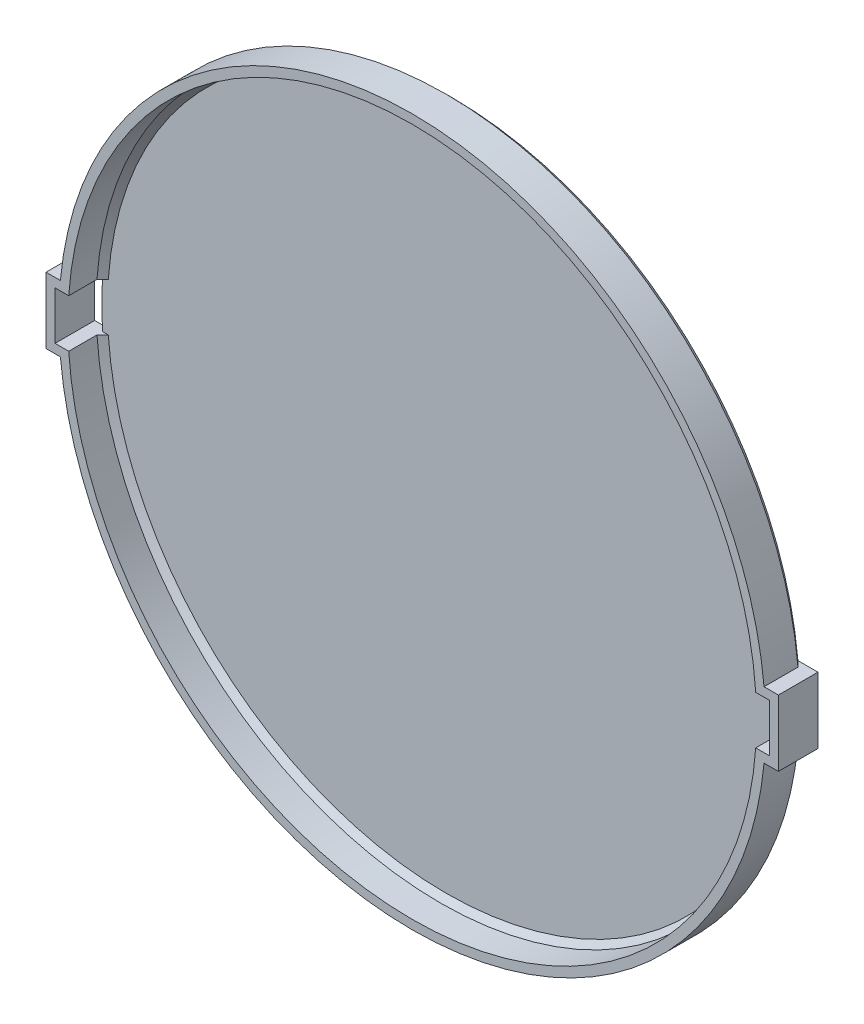
ISO-10303-21;
HEADER;
FILE_DESCRIPTION(('STEP AP214'),'2;1');
FILE_NAME('part.step','',(''),(''),'','','');
FILE_SCHEMA(('AUTOMOTIVE_DESIGN { 1 0 10303 214 1 1 1 1 }'));
ENDSEC;
DATA;
#1=APPLICATION_CONTEXT('core data for automotive mechanical design processes');
#2=APPLICATION_PROTOCOL_DEFINITION('international standard','automotive_design',2000,#1);
#3=PRODUCT_CONTEXT('',#1,'mechanical');
#4=PRODUCT('Part','Part','',(#3));
#5=PRODUCT_RELATED_PRODUCT_CATEGORY('part','',(#4));
#6=PRODUCT_DEFINITION_FORMATION('','',#4);
#7=PRODUCT_DEFINITION_CONTEXT('part definition',#1,'design');
#8=PRODUCT_DEFINITION('design','',#6,#7);
#9=PRODUCT_DEFINITION_SHAPE('','',#8);
#10=(LENGTH_UNIT() NAMED_UNIT(*) SI_UNIT(.MILLI.,.METRE.));
#11=(NAMED_UNIT(*) PLANE_ANGLE_UNIT() SI_UNIT($,.RADIAN.));
#12=(NAMED_UNIT(*) SI_UNIT($,.STERADIAN.) SOLID_ANGLE_UNIT());
#13=UNCERTAINTY_MEASURE_WITH_UNIT(LENGTH_MEASURE(1.E-05),#10,'distance_accuracy_value','');
#14=(GEOMETRIC_REPRESENTATION_CONTEXT(3) GLOBAL_UNCERTAINTY_ASSIGNED_CONTEXT((#13)) GLOBAL_UNIT_ASSIGNED_CONTEXT((#10,
#11,#12)) REPRESENTATION_CONTEXT('',''));
#15=CARTESIAN_POINT('',(0.,0.,0.));
#16=DIRECTION('',(0.,0.,1.));
#17=DIRECTION('',(1.,0.,0.));
#18=AXIS2_PLACEMENT_3D('',#15,#16,#17);
#19=CARTESIAN_POINT('',(0.,0.,6.));
#20=DIRECTION('',(0.,0.,-1.));
#21=DIRECTION('',(-1.,0.,0.));
#22=AXIS2_PLACEMENT_3D('',#19,#20,#21);
#23=CYLINDRICAL_SURFACE('',#22,62.5);
#24=DIRECTION('',(0.,0.,-1.));
#25=VECTOR('',#24,1.);
#26=CARTESIAN_POINT('',(-62.225617714893,-5.85,17.9719254138495));
#27=LINE('',#26,#25);
#28=CARTESIAN_POINT('',(-62.225617714893,-5.85,6.));
#29=VERTEX_POINT('',#28);
#30=CARTESIAN_POINT('',(-62.225617714893,-5.85,0.));
#31=VERTEX_POINT('',#30);
#32=EDGE_CURVE('E288',#29,#31,#27,.T.);
#33=ORIENTED_EDGE('',*,*,#32,.T.);
#34=CARTESIAN_POINT('',(0.,0.,0.));
#35=DIRECTION('',(0.,0.,1.));
#36=DIRECTION('',(1.,0.,0.));
#37=AXIS2_PLACEMENT_3D('',#34,#35,#36);
#38=CIRCLE('',#37,62.5);
#39=CARTESIAN_POINT('',(62.225617714893,-5.85,0.));
#40=VERTEX_POINT('',#39);
#41=EDGE_CURVE('E345',#31,#40,#38,.T.);
#42=ORIENTED_EDGE('',*,*,#41,.T.);
#43=DIRECTION('',(0.,0.,-1.));
#44=VECTOR('',#43,1.);
#45=CARTESIAN_POINT('',(62.225617714893,-5.85,17.9719254138495));
#46=LINE('',#45,#44);
#47=CARTESIAN_POINT('',(62.225617714893,-5.85,6.));
#48=VERTEX_POINT('',#47);
#49=EDGE_CURVE('E248',#48,#40,#46,.T.);
#50=ORIENTED_EDGE('',*,*,#49,.F.);
#51=CARTESIAN_POINT('',(0.,0.,6.));
#52=DIRECTION('',(0.,0.,1.));
#53=DIRECTION('',(1.,0.,0.));
#54=AXIS2_PLACEMENT_3D('',#51,#52,#53);
#55=CIRCLE('',#54,62.5);
#56=EDGE_CURVE('E331',#29,#48,#55,.T.);
#57=ORIENTED_EDGE('',*,*,#56,.F.);
#58=EDGE_LOOP('',(#33,#42,#50,#57));
#59=FACE_BOUND('',#58,.T.);
#60=ADVANCED_FACE('F35',(#59),#23,.T.);
#61=CARTESIAN_POINT('',(0.,0.,6.));
#62=DIRECTION('',(0.,0.,-1.));
#63=DIRECTION('',(-1.,0.,0.));
#64=AXIS2_PLACEMENT_3D('',#61,#62,#63);
#65=CYLINDRICAL_SURFACE('',#64,60.9);
#66=DIRECTION('',(0.,0.,-1.));
#67=VECTOR('',#66,1.);
#68=CARTESIAN_POINT('',(60.7515226146637,-4.25,6.));
#69=LINE('',#68,#67);
#70=CARTESIAN_POINT('',(60.7515226146637,-4.25,6.));
#71=VERTEX_POINT('',#70);
#72=CARTESIAN_POINT('',(60.7515226146637,-4.25,0.999999999999994));
#73=VERTEX_POINT('',#72);
#74=EDGE_CURVE('E266',#71,#73,#69,.T.);
#75=ORIENTED_EDGE('',*,*,#74,.T.);
#76=CARTESIAN_POINT('',(0.,0.,0.999999999999994));
#77=DIRECTION('',(0.,0.,1.));
#78=DIRECTION('',(1.,0.,0.));
#79=AXIS2_PLACEMENT_3D('',#76,#77,#78);
#80=CIRCLE('',#79,60.9);
#81=CARTESIAN_POINT('',(-60.7515226146637,-4.25,0.999999999999994));
#82=VERTEX_POINT('',#81);
#83=EDGE_CURVE('E360',#73,#82,#80,.F.);
#84=ORIENTED_EDGE('',*,*,#83,.T.);
#85=DIRECTION('',(0.,0.,-1.));
#86=VECTOR('',#85,1.);
#87=CARTESIAN_POINT('',(-60.7515226146637,-4.25,6.));
#88=LINE('',#87,#86);
#89=CARTESIAN_POINT('',(-60.7515226146637,-4.25,6.));
#90=VERTEX_POINT('',#89);
#91=EDGE_CURVE('E318',#90,#82,#88,.T.);
#92=ORIENTED_EDGE('',*,*,#91,.F.);
#93=CARTESIAN_POINT('',(0.,0.,6.));
#94=DIRECTION('',(0.,0.,1.));
#95=DIRECTION('',(1.,0.,0.));
#96=AXIS2_PLACEMENT_3D('',#93,#94,#95);
#97=CIRCLE('',#96,60.9);
#98=EDGE_CURVE('E326',#90,#71,#97,.T.);
#99=ORIENTED_EDGE('',*,*,#98,.T.);
#100=EDGE_LOOP('',(#75,#84,#92,#99));
#101=FACE_BOUND('',#100,.T.);
#102=ADVANCED_FACE('F480',(#101),#65,.F.);
#103=DIRECTION('',(0.,0.,-1.));
#104=VECTOR('',#103,1.);
#105=CARTESIAN_POINT('',(62.225617714893,5.85,17.9719254138495));
#106=LINE('',#105,#104);
#107=CARTESIAN_POINT('',(62.225617714893,5.85,6.));
#108=VERTEX_POINT('',#107);
#109=CARTESIAN_POINT('',(62.225617714893,5.85,0.));
#110=VERTEX_POINT('',#109);
#111=EDGE_CURVE('E220',#108,#110,#106,.T.);
#112=ORIENTED_EDGE('',*,*,#111,.T.);
#113=CARTESIAN_POINT('',(0.,0.,0.));
#114=DIRECTION('',(0.,0.,1.));
#115=DIRECTION('',(1.,0.,0.));
#116=AXIS2_PLACEMENT_3D('',#113,#114,#115);
#117=CIRCLE('',#116,62.5);
#118=CARTESIAN_POINT('',(-62.225617714893,5.85,0.));
#119=VERTEX_POINT('',#118);
#120=EDGE_CURVE('E334',#110,#119,#117,.T.);
#121=ORIENTED_EDGE('',*,*,#120,.T.);
#122=DIRECTION('',(0.,0.,-1.));
#123=VECTOR('',#122,1.);
#124=CARTESIAN_POINT('',(-62.225617714893,5.85,17.9719254138495));
#125=LINE('',#124,#123);
#126=CARTESIAN_POINT('',(-62.225617714893,5.85,6.));
#127=VERTEX_POINT('',#126);
#128=EDGE_CURVE('E293',#127,#119,#125,.T.);
#129=ORIENTED_EDGE('',*,*,#128,.F.);
#130=EDGE_CURVE('E329',#108,#127,#55,.T.);
#131=ORIENTED_EDGE('',*,*,#130,.F.);
#132=EDGE_LOOP('',(#112,#121,#129,#131));
#133=FACE_BOUND('',#132,.T.);
#134=ADVANCED_FACE('F483',(#133),#23,.T.);
#135=DIRECTION('',(0.,0.,-1.));
#136=VECTOR('',#135,1.);
#137=CARTESIAN_POINT('',(-60.7515226146637,4.25,6.));
#138=LINE('',#137,#136);
#139=CARTESIAN_POINT('',(-60.7515226146637,4.25,6.));
#140=VERTEX_POINT('',#139);
#141=CARTESIAN_POINT('',(-60.7515226146637,4.25,0.999999999999994));
#142=VERTEX_POINT('',#141);
#143=EDGE_CURVE('E322',#140,#142,#138,.T.);
#144=ORIENTED_EDGE('',*,*,#143,.T.);
#145=CARTESIAN_POINT('',(0.,0.,0.999999999999994));
#146=DIRECTION('',(0.,0.,1.));
#147=DIRECTION('',(1.,0.,0.));
#148=AXIS2_PLACEMENT_3D('',#145,#146,#147);
#149=CIRCLE('',#148,60.9);
#150=CARTESIAN_POINT('',(60.7515226146637,4.25,0.999999999999994));
#151=VERTEX_POINT('',#150);
#152=EDGE_CURVE('E362',#142,#151,#149,.F.);
#153=ORIENTED_EDGE('',*,*,#152,.T.);
#154=DIRECTION('',(0.,0.,-1.));
#155=VECTOR('',#154,1.);
#156=CARTESIAN_POINT('',(60.7515226146637,4.25,6.));
#157=LINE('',#156,#155);
#158=CARTESIAN_POINT('',(60.7515226146637,4.25,6.));
#159=VERTEX_POINT('',#158);
#160=EDGE_CURVE('E262',#159,#151,#157,.T.);
#161=ORIENTED_EDGE('',*,*,#160,.F.);
#162=EDGE_CURVE('E330',#159,#140,#97,.T.);
#163=ORIENTED_EDGE('',*,*,#162,.T.);
#164=EDGE_LOOP('',(#144,#153,#161,#163));
#165=FACE_BOUND('',#164,.T.);
#166=ADVANCED_FACE('F389',(#165),#65,.F.);
#167=CARTESIAN_POINT('',(0.,0.,6.));
#168=DIRECTION('',(0.,0.,1.));
#169=DIRECTION('',(1.,0.,0.));
#170=AXIS2_PLACEMENT_3D('',#167,#168,#169);
#171=PLANE('',#170);
#172=ORIENTED_EDGE('',*,*,#56,.T.);
#173=DIRECTION('',(1.,0.,0.));
#174=VECTOR('',#173,1.);
#175=CARTESIAN_POINT('',(0.,-5.85,6.));
#176=LINE('',#175,#174);
#177=CARTESIAN_POINT('',(64.762741699797,-5.85,6.));
#178=VERTEX_POINT('',#177);
#179=EDGE_CURVE('E240',#48,#178,#176,.T.);
#180=ORIENTED_EDGE('',*,*,#179,.T.);
#181=DIRECTION('',(0.,-1.,0.));
#182=VECTOR('',#181,1.);
#183=CARTESIAN_POINT('',(64.762741699797,0.,6.));
#184=LINE('',#183,#182);
#185=CARTESIAN_POINT('',(64.762741699797,5.85,6.));
#186=VERTEX_POINT('',#185);
#187=EDGE_CURVE('E243',#186,#178,#184,.T.);
#188=ORIENTED_EDGE('',*,*,#187,.F.);
#189=DIRECTION('',(1.,0.,0.));
#190=VECTOR('',#189,1.);
#191=CARTESIAN_POINT('',(0.,5.85,6.));
#192=LINE('',#191,#190);
#193=EDGE_CURVE('E236',#108,#186,#192,.T.);
#194=ORIENTED_EDGE('',*,*,#193,.F.);
#195=ORIENTED_EDGE('',*,*,#130,.T.);
#196=DIRECTION('',(-1.,0.,0.));
#197=VECTOR('',#196,1.);
#198=CARTESIAN_POINT('',(0.,5.85,6.));
#199=LINE('',#198,#197);
#200=CARTESIAN_POINT('',(-64.762741699797,5.85,6.));
#201=VERTEX_POINT('',#200);
#202=EDGE_CURVE('E279',#127,#201,#199,.T.);
#203=ORIENTED_EDGE('',*,*,#202,.T.);
#204=DIRECTION('',(0.,-1.,0.));
#205=VECTOR('',#204,1.);
#206=CARTESIAN_POINT('',(-64.762741699797,0.,6.));
#207=LINE('',#206,#205);
#208=CARTESIAN_POINT('',(-64.762741699797,-5.85,6.));
#209=VERTEX_POINT('',#208);
#210=EDGE_CURVE('E281',#201,#209,#207,.T.);
#211=ORIENTED_EDGE('',*,*,#210,.T.);
#212=DIRECTION('',(-1.,0.,0.));
#213=VECTOR('',#212,1.);
#214=CARTESIAN_POINT('',(0.,-5.85,6.));
#215=LINE('',#214,#213);
#216=EDGE_CURVE('E284',#29,#209,#215,.T.);
#217=ORIENTED_EDGE('',*,*,#216,.F.);
#218=EDGE_LOOP('',(#172,#180,#188,#194,#195,#203,#211,#217));
#219=FACE_BOUND('',#218,.T.);
#220=DIRECTION('',(-1.,0.,0.));
#221=VECTOR('',#220,1.);
#222=CARTESIAN_POINT('',(0.,-4.25,6.));
#223=LINE('',#222,#221);
#224=CARTESIAN_POINT('',(63.162741699797,-4.25,6.));
#225=VERTEX_POINT('',#224);
#226=EDGE_CURVE('E210',#225,#71,#223,.T.);
#227=ORIENTED_EDGE('',*,*,#226,.T.);
#228=ORIENTED_EDGE('',*,*,#98,.F.);
#229=DIRECTION('',(1.,0.,0.));
#230=VECTOR('',#229,1.);
#231=CARTESIAN_POINT('',(0.,-4.25,6.));
#232=LINE('',#231,#230);
#233=CARTESIAN_POINT('',(-63.162741699797,-4.25,6.));
#234=VERTEX_POINT('',#233);
#235=EDGE_CURVE('E315',#234,#90,#232,.T.);
#236=ORIENTED_EDGE('',*,*,#235,.F.);
#237=DIRECTION('',(0.,-1.,0.));
#238=VECTOR('',#237,1.);
#239=CARTESIAN_POINT('',(-63.162741699797,0.,6.));
#240=LINE('',#239,#238);
#241=CARTESIAN_POINT('',(-63.162741699797,4.25,6.));
#242=VERTEX_POINT('',#241);
#243=EDGE_CURVE('E289',#242,#234,#240,.T.);
#244=ORIENTED_EDGE('',*,*,#243,.F.);
#245=DIRECTION('',(-1.,0.,0.));
#246=VECTOR('',#245,1.);
#247=CARTESIAN_POINT('',(0.,4.25,6.));
#248=LINE('',#247,#246);
#249=EDGE_CURVE('E313',#140,#242,#248,.T.);
#250=ORIENTED_EDGE('',*,*,#249,.F.);
#251=ORIENTED_EDGE('',*,*,#162,.F.);
#252=DIRECTION('',(1.,0.,0.));
#253=VECTOR('',#252,1.);
#254=CARTESIAN_POINT('',(0.,4.25,6.));
#255=LINE('',#254,#253);
#256=CARTESIAN_POINT('',(63.162741699797,4.25,6.));
#257=VERTEX_POINT('',#256);
#258=EDGE_CURVE('E260',#159,#257,#255,.T.);
#259=ORIENTED_EDGE('',*,*,#258,.T.);
#260=DIRECTION('',(0.,-1.,0.));
#261=VECTOR('',#260,1.);
#262=CARTESIAN_POINT('',(63.162741699797,0.,6.));
#263=LINE('',#262,#261);
#264=EDGE_CURVE('E219',#257,#225,#263,.T.);
#265=ORIENTED_EDGE('',*,*,#264,.T.);
#266=EDGE_LOOP('',(#227,#228,#236,#244,#250,#251,#259,#265));
#267=FACE_BOUND('',#266,.T.);
#268=ADVANCED_FACE('F463',(#219,#267),#171,.T.);
#269=CARTESIAN_POINT('',(0.,0.,-1.));
#270=DIRECTION('',(0.,0.,1.));
#271=DIRECTION('',(1.,0.,0.));
#272=AXIS2_PLACEMENT_3D('',#269,#270,#271);
#273=PLANE('',#272);
#274=DIRECTION('',(-1.,0.,0.));
#275=VECTOR('',#274,1.);
#276=CARTESIAN_POINT('',(0.,-4.25,-1.));
#277=LINE('',#276,#275);
#278=CARTESIAN_POINT('',(63.162741699797,-4.25,-1.));
#279=VERTEX_POINT('',#278);
#280=CARTESIAN_POINT('',(60.7515226146637,-4.25,-1.));
#281=VERTEX_POINT('',#280);
#282=EDGE_CURVE('E211',#279,#281,#277,.T.);
#283=ORIENTED_EDGE('',*,*,#282,.F.);
#284=DIRECTION('',(0.,1.,0.));
#285=VECTOR('',#284,1.);
#286=CARTESIAN_POINT('',(63.162741699797,0.,-1.));
#287=LINE('',#286,#285);
#288=CARTESIAN_POINT('',(63.162741699797,4.25,-1.));
#289=VERTEX_POINT('',#288);
#290=EDGE_CURVE('E217',#279,#289,#287,.T.);
#291=ORIENTED_EDGE('',*,*,#290,.T.);
#292=DIRECTION('',(1.,0.,0.));
#293=VECTOR('',#292,1.);
#294=CARTESIAN_POINT('',(0.,4.25,-1.));
#295=LINE('',#294,#293);
#296=CARTESIAN_POINT('',(60.7515226146637,4.25,-1.));
#297=VERTEX_POINT('',#296);
#298=EDGE_CURVE('E199',#297,#289,#295,.T.);
#299=ORIENTED_EDGE('',*,*,#298,.F.);
#300=CARTESIAN_POINT('',(0.,0.,-1.));
#301=DIRECTION('',(0.,0.,-1.));
#302=DIRECTION('',(-1.,0.,0.));
#303=AXIS2_PLACEMENT_3D('',#300,#301,#302);
#304=CIRCLE('',#303,60.9);
#305=EDGE_CURVE('E255',#297,#281,#304,.T.);
#306=ORIENTED_EDGE('',*,*,#305,.T.);
#307=EDGE_LOOP('',(#283,#291,#299,#306));
#308=FACE_BOUND('',#307,.T.);
#309=DIRECTION('',(1.,0.,0.));
#310=VECTOR('',#309,1.);
#311=CARTESIAN_POINT('',(0.,5.85,-1.));
#312=LINE('',#311,#310);
#313=CARTESIAN_POINT('',(-64.762741699797,5.85,-1.));
#314=VERTEX_POINT('',#313);
#315=CARTESIAN_POINT('',(-61.221136056104,5.85,-1.));
#316=VERTEX_POINT('',#315);
#317=EDGE_CURVE('E277',#314,#316,#312,.T.);
#318=ORIENTED_EDGE('',*,*,#317,.T.);
#319=CARTESIAN_POINT('',(0.,0.,-1.));
#320=DIRECTION('',(0.,0.,1.));
#321=DIRECTION('',(1.,0.,0.));
#322=AXIS2_PLACEMENT_3D('',#319,#320,#321);
#323=CIRCLE('',#322,61.5);
#324=CARTESIAN_POINT('',(61.221136056104,5.85,-1.));
#325=VERTEX_POINT('',#324);
#326=EDGE_CURVE('E342',#316,#325,#323,.F.);
#327=ORIENTED_EDGE('',*,*,#326,.T.);
#328=DIRECTION('',(-1.,0.,0.));
#329=VECTOR('',#328,1.);
#330=CARTESIAN_POINT('',(0.,5.85,-1.));
#331=LINE('',#330,#329);
#332=CARTESIAN_POINT('',(64.762741699797,5.85,-1.));
#333=VERTEX_POINT('',#332);
#334=EDGE_CURVE('E234',#333,#325,#331,.T.);
#335=ORIENTED_EDGE('',*,*,#334,.F.);
#336=DIRECTION('',(0.,1.,0.));
#337=VECTOR('',#336,1.);
#338=CARTESIAN_POINT('',(64.762741699797,0.,-1.));
#339=LINE('',#338,#337);
#340=CARTESIAN_POINT('',(64.762741699797,-5.85,-1.));
#341=VERTEX_POINT('',#340);
#342=EDGE_CURVE('E229',#341,#333,#339,.T.);
#343=ORIENTED_EDGE('',*,*,#342,.F.);
#344=DIRECTION('',(-1.,0.,0.));
#345=VECTOR('',#344,1.);
#346=CARTESIAN_POINT('',(0.,-5.85,-1.));
#347=LINE('',#346,#345);
#348=CARTESIAN_POINT('',(61.221136056104,-5.85,-1.));
#349=VERTEX_POINT('',#348);
#350=EDGE_CURVE('E227',#341,#349,#347,.T.);
#351=ORIENTED_EDGE('',*,*,#350,.T.);
#352=CARTESIAN_POINT('',(0.,0.,-1.));
#353=DIRECTION('',(0.,0.,1.));
#354=DIRECTION('',(1.,0.,0.));
#355=AXIS2_PLACEMENT_3D('',#352,#353,#354);
#356=CIRCLE('',#355,61.5);
#357=CARTESIAN_POINT('',(-61.221136056104,-5.85,-1.));
#358=VERTEX_POINT('',#357);
#359=EDGE_CURVE('E339',#349,#358,#356,.F.);
#360=ORIENTED_EDGE('',*,*,#359,.T.);
#361=DIRECTION('',(1.,0.,0.));
#362=VECTOR('',#361,1.);
#363=CARTESIAN_POINT('',(0.,-5.85,-1.));
#364=LINE('',#363,#362);
#365=CARTESIAN_POINT('',(-64.762741699797,-5.85,-1.));
#366=VERTEX_POINT('',#365);
#367=EDGE_CURVE('E272',#366,#358,#364,.T.);
#368=ORIENTED_EDGE('',*,*,#367,.F.);
#369=DIRECTION('',(0.,1.,0.));
#370=VECTOR('',#369,1.);
#371=CARTESIAN_POINT('',(-64.762741699797,0.,-1.));
#372=LINE('',#371,#370);
#373=EDGE_CURVE('E269',#366,#314,#372,.T.);
#374=ORIENTED_EDGE('',*,*,#373,.T.);
#375=EDGE_LOOP('',(#318,#327,#335,#343,#351,#360,#368,#374));
#376=FACE_BOUND('',#375,.T.);
#377=DIRECTION('',(-1.,0.,0.));
#378=VECTOR('',#377,1.);
#379=CARTESIAN_POINT('',(0.,4.25,-1.));
#380=LINE('',#379,#378);
#381=CARTESIAN_POINT('',(-60.7515226146637,4.25,-1.));
#382=VERTEX_POINT('',#381);
#383=CARTESIAN_POINT('',(-63.162741699797,4.25,-1.));
#384=VERTEX_POINT('',#383);
#385=EDGE_CURVE('E308',#382,#384,#380,.T.);
#386=ORIENTED_EDGE('',*,*,#385,.T.);
#387=DIRECTION('',(0.,1.,0.));
#388=VECTOR('',#387,1.);
#389=CARTESIAN_POINT('',(-63.162741699797,0.,-1.));
#390=LINE('',#389,#388);
#391=CARTESIAN_POINT('',(-63.162741699797,-4.25,-1.));
#392=VERTEX_POINT('',#391);
#393=EDGE_CURVE('E274',#392,#384,#390,.T.);
#394=ORIENTED_EDGE('',*,*,#393,.F.);
#395=DIRECTION('',(1.,0.,0.));
#396=VECTOR('',#395,1.);
#397=CARTESIAN_POINT('',(0.,-4.25,-1.));
#398=LINE('',#397,#396);
#399=CARTESIAN_POINT('',(-60.7515226146637,-4.25,-1.));
#400=VERTEX_POINT('',#399);
#401=EDGE_CURVE('E310',#392,#400,#398,.T.);
#402=ORIENTED_EDGE('',*,*,#401,.T.);
#403=CARTESIAN_POINT('',(0.,0.,-1.));
#404=DIRECTION('',(0.,0.,1.));
#405=DIRECTION('',(1.,0.,0.));
#406=AXIS2_PLACEMENT_3D('',#403,#404,#405);
#407=CIRCLE('',#406,60.9);
#408=EDGE_CURVE('E296',#382,#400,#407,.T.);
#409=ORIENTED_EDGE('',*,*,#408,.F.);
#410=EDGE_LOOP('',(#386,#394,#402,#409));
#411=FACE_BOUND('',#410,.T.);
#412=ADVANCED_FACE('F223',(#308,#376,#411),#273,.F.);
#413=CARTESIAN_POINT('',(0.,0.,0.));
#414=DIRECTION('',(0.,0.,1.));
#415=DIRECTION('',(1.,0.,0.));
#416=AXIS2_PLACEMENT_3D('',#413,#414,#415);
#417=PLANE('',#416);
#418=CARTESIAN_POINT('',(0.,0.,0.));
#419=DIRECTION('',(0.,0.,1.));
#420=DIRECTION('',(1.,0.,0.));
#421=AXIS2_PLACEMENT_3D('',#418,#419,#420);
#422=CIRCLE('',#421,59.9);
#423=CARTESIAN_POINT('',(-59.7490376491538,-4.25,0.));
#424=VERTEX_POINT('',#423);
#425=CARTESIAN_POINT('',(59.7490376491538,-4.25,0.));
#426=VERTEX_POINT('',#425);
#427=EDGE_CURVE('E355',#424,#426,#422,.T.);
#428=ORIENTED_EDGE('',*,*,#427,.T.);
#429=DIRECTION('',(1.,0.,0.));
#430=VECTOR('',#429,1.);
#431=CARTESIAN_POINT('',(0.,-4.25,0.));
#432=LINE('',#431,#430);
#433=CARTESIAN_POINT('',(60.7515226146637,-4.25,0.));
#434=VERTEX_POINT('',#433);
#435=EDGE_CURVE('E358',#426,#434,#432,.T.);
#436=ORIENTED_EDGE('',*,*,#435,.T.);
#437=CARTESIAN_POINT('',(0.,0.,0.));
#438=DIRECTION('',(0.,0.,1.));
#439=DIRECTION('',(1.,0.,0.));
#440=AXIS2_PLACEMENT_3D('',#437,#438,#439);
#441=CIRCLE('',#440,60.9);
#442=CARTESIAN_POINT('',(60.7515226146637,4.25,0.));
#443=VERTEX_POINT('',#442);
#444=EDGE_CURVE('E325',#434,#443,#441,.T.);
#445=ORIENTED_EDGE('',*,*,#444,.T.);
#446=DIRECTION('',(-1.,0.,0.));
#447=VECTOR('',#446,1.);
#448=CARTESIAN_POINT('',(0.,4.25,0.));
#449=LINE('',#448,#447);
#450=CARTESIAN_POINT('',(59.7490376491538,4.25,0.));
#451=VERTEX_POINT('',#450);
#452=EDGE_CURVE('E54',#443,#451,#449,.T.);
#453=ORIENTED_EDGE('',*,*,#452,.T.);
#454=CARTESIAN_POINT('',(0.,0.,0.));
#455=DIRECTION('',(0.,0.,1.));
#456=DIRECTION('',(1.,0.,0.));
#457=AXIS2_PLACEMENT_3D('',#454,#455,#456);
#458=CIRCLE('',#457,59.9);
#459=CARTESIAN_POINT('',(-59.7490376491538,4.25,0.));
#460=VERTEX_POINT('',#459);
#461=EDGE_CURVE('E349',#451,#460,#458,.T.);
#462=ORIENTED_EDGE('',*,*,#461,.T.);
#463=DIRECTION('',(-1.,0.,0.));
#464=VECTOR('',#463,1.);
#465=CARTESIAN_POINT('',(0.,4.25,0.));
#466=LINE('',#465,#464);
#467=CARTESIAN_POINT('',(-60.7515226146637,4.25,0.));
#468=VERTEX_POINT('',#467);
#469=EDGE_CURVE('E352',#460,#468,#466,.T.);
#470=ORIENTED_EDGE('',*,*,#469,.T.);
#471=CARTESIAN_POINT('',(-60.7515226146637,-4.25,0.));
#472=VERTEX_POINT('',#471);
#473=EDGE_CURVE('E335',#468,#472,#441,.T.);
#474=ORIENTED_EDGE('',*,*,#473,.T.);
#475=DIRECTION('',(1.,0.,0.));
#476=VECTOR('',#475,1.);
#477=CARTESIAN_POINT('',(0.,-4.25,0.));
#478=LINE('',#477,#476);
#479=EDGE_CURVE('E62',#472,#424,#478,.T.);
#480=ORIENTED_EDGE('',*,*,#479,.T.);
#481=EDGE_LOOP('',(#428,#436,#445,#453,#462,#470,#474,#480));
#482=FACE_BOUND('',#481,.T.);
#483=ADVANCED_FACE('F453',(#482),#417,.T.);
#484=CARTESIAN_POINT('',(0.,0.,6.));
#485=DIRECTION('',(0.,0.,-1.));
#486=DIRECTION('',(-1.,0.,0.));
#487=AXIS2_PLACEMENT_3D('',#484,#485,#486);
#488=CYLINDRICAL_SURFACE('',#487,60.9);
#489=ORIENTED_EDGE('',*,*,#473,.F.);
#490=EDGE_CURVE('E321',#468,#382,#138,.T.);
#491=ORIENTED_EDGE('',*,*,#490,.T.);
#492=ORIENTED_EDGE('',*,*,#408,.T.);
#493=EDGE_CURVE('E317',#472,#400,#88,.T.);
#494=ORIENTED_EDGE('',*,*,#493,.F.);
#495=EDGE_LOOP('',(#489,#491,#492,#494));
#496=FACE_BOUND('',#495,.T.);
#497=ADVANCED_FACE('F474',(#496),#488,.T.);
#498=CARTESIAN_POINT('',(0.,4.25,6.));
#499=DIRECTION('',(0.,-1.,0.));
#500=DIRECTION('',(0.,0.,-1.));
#501=AXIS2_PLACEMENT_3D('',#498,#499,#500);
#502=PLANE('',#501);
#503=ORIENTED_EDGE('',*,*,#143,.F.);
#504=ORIENTED_EDGE('',*,*,#249,.T.);
#505=DIRECTION('',(0.,0.,-1.));
#506=VECTOR('',#505,1.);
#507=CARTESIAN_POINT('',(-63.162741699797,4.25,17.9719254138495));
#508=LINE('',#507,#506);
#509=EDGE_CURVE('E283',#242,#384,#508,.T.);
#510=ORIENTED_EDGE('',*,*,#509,.T.);
#511=ORIENTED_EDGE('',*,*,#385,.F.);
#512=ORIENTED_EDGE('',*,*,#490,.F.);
#513=ORIENTED_EDGE('',*,*,#469,.F.);
#514=CARTESIAN_POINT('',(-59.7490376491538,4.25,0.));
#515=CARTESIAN_POINT('',(-59.9161219094726,4.25,0.166663225402903));
#516=CARTESIAN_POINT('',(-60.0832044534246,4.25,0.333328171437761));
#517=CARTESIAN_POINT('',(-60.4173661085946,4.25,0.666661504771092));
#518=CARTESIAN_POINT('',(-60.5844452198126,4.25,0.833329892069566));
#519=CARTESIAN_POINT('',(-60.7515226146637,4.25,0.999999999999993));
#520=B_SPLINE_CURVE_WITH_KNOTS('',3,(#514,#515,#516,#517,#518,#519),.UNSPECIFIED.,.F.,.F.,(4,2,
4),(0.,0.707985894331522,1.4159717886618),.UNSPECIFIED.);
#521=EDGE_CURVE('E48',#460,#142,#520,.T.);
#522=ORIENTED_EDGE('',*,*,#521,.T.);
#523=EDGE_LOOP('',(#503,#504,#510,#511,#512,#513,#522));
#524=FACE_BOUND('',#523,.T.);
#525=ADVANCED_FACE('F430',(#524),#502,.T.);
#526=CARTESIAN_POINT('',(0.,-4.25,6.));
#527=DIRECTION('',(0.,1.,0.));
#528=DIRECTION('',(0.,0.,1.));
#529=AXIS2_PLACEMENT_3D('',#526,#527,#528);
#530=PLANE('',#529);
#531=ORIENTED_EDGE('',*,*,#401,.F.);
#532=DIRECTION('',(0.,0.,-1.));
#533=VECTOR('',#532,1.);
#534=CARTESIAN_POINT('',(-63.162741699797,-4.25,17.9719254138495));
#535=LINE('',#534,#533);
#536=EDGE_CURVE('E292',#234,#392,#535,.T.);
#537=ORIENTED_EDGE('',*,*,#536,.F.);
#538=ORIENTED_EDGE('',*,*,#235,.T.);
#539=ORIENTED_EDGE('',*,*,#91,.T.);
#540=CARTESIAN_POINT('',(-60.7515226146637,-4.25,0.999999999999994));
#541=CARTESIAN_POINT('',(-60.5844452198126,-4.25,0.833329892069566));
#542=CARTESIAN_POINT('',(-60.4173661085946,-4.25,0.666661504771092));
#543=CARTESIAN_POINT('',(-60.0832044534246,-4.25,0.333328171437761));
#544=CARTESIAN_POINT('',(-59.9161219094726,-4.25,0.166663225402903));
#545=CARTESIAN_POINT('',(-59.7490376491538,-4.25,0.));
#546=B_SPLINE_CURVE_WITH_KNOTS('',3,(#540,#541,#542,#543,#544,#545),.UNSPECIFIED.,.F.,.F.,(4,2,
4),(0.,0.70798589433028,1.4159717886618),.UNSPECIFIED.);
#547=EDGE_CURVE('E433',#82,#424,#546,.T.);
#548=ORIENTED_EDGE('',*,*,#547,.T.);
#549=ORIENTED_EDGE('',*,*,#479,.F.);
#550=ORIENTED_EDGE('',*,*,#493,.T.);
#551=EDGE_LOOP('',(#531,#537,#538,#539,#548,#549,#550));
#552=FACE_BOUND('',#551,.T.);
#553=ADVANCED_FACE('F425',(#552),#530,.T.);
#554=CARTESIAN_POINT('',(-63.162741699797,0.,17.9719254138495));
#555=DIRECTION('',(1.,0.,0.));
#556=DIRECTION('',(0.,0.,-1.));
#557=AXIS2_PLACEMENT_3D('',#554,#555,#556);
#558=PLANE('',#557);
#559=ORIENTED_EDGE('',*,*,#509,.F.);
#560=ORIENTED_EDGE('',*,*,#243,.T.);
#561=ORIENTED_EDGE('',*,*,#536,.T.);
#562=ORIENTED_EDGE('',*,*,#393,.T.);
#563=EDGE_LOOP('',(#559,#560,#561,#562));
#564=FACE_BOUND('',#563,.T.);
#565=ADVANCED_FACE('F421',(#564),#558,.T.);
#566=CARTESIAN_POINT('',(0.,-5.85,17.9719254138495));
#567=DIRECTION('',(0.,-1.,0.));
#568=DIRECTION('',(0.,0.,-1.));
#569=AXIS2_PLACEMENT_3D('',#566,#567,#568);
#570=PLANE('',#569);
#571=ORIENTED_EDGE('',*,*,#32,.F.);
#572=ORIENTED_EDGE('',*,*,#216,.T.);
#573=DIRECTION('',(0.,0.,-1.));
#574=VECTOR('',#573,1.);
#575=CARTESIAN_POINT('',(-64.762741699797,-5.85,17.9719254138495));
#576=LINE('',#575,#574);
#577=EDGE_CURVE('E287',#209,#366,#576,.T.);
#578=ORIENTED_EDGE('',*,*,#577,.T.);
#579=ORIENTED_EDGE('',*,*,#367,.T.);
#580=CARTESIAN_POINT('',(-61.221136056104,-5.85,-1.));
#581=CARTESIAN_POINT('',(-61.3885557030754,-5.85,-0.833339397562179));
#582=CARTESIAN_POINT('',(-61.5559723314603,-5.85,-0.666675763009716));
#583=CARTESIAN_POINT('',(-61.8907995510566,-5.85,-0.333342429676386));
#584=CARTESIAN_POINT('',(-62.058210142268,-5.85,-0.166672730895518));
#585=CARTESIAN_POINT('',(-62.225617714893,-5.85,0.));
#586=B_SPLINE_CURVE_WITH_KNOTS('',3,(#580,#581,#582,#583,#584,#585),.UNSPECIFIED.,.F.,.F.,(4,2,
4),(0.,0.708693058296919,1.41738611659009),.UNSPECIFIED.);
#587=EDGE_CURVE('E404',#358,#31,#586,.T.);
#588=ORIENTED_EDGE('',*,*,#587,.T.);
#589=EDGE_LOOP('',(#571,#572,#578,#579,#588));
#590=FACE_BOUND('',#589,.T.);
#591=ADVANCED_FACE('F416',(#590),#570,.T.);
#592=CARTESIAN_POINT('',(-64.762741699797,0.,17.9719254138495));
#593=DIRECTION('',(1.,0.,0.));
#594=DIRECTION('',(0.,0.,-1.));
#595=AXIS2_PLACEMENT_3D('',#592,#593,#594);
#596=PLANE('',#595);
#597=ORIENTED_EDGE('',*,*,#210,.F.);
#598=DIRECTION('',(0.,0.,-1.));
#599=VECTOR('',#598,1.);
#600=CARTESIAN_POINT('',(-64.762741699797,5.85,17.9719254138495));
#601=LINE('',#600,#599);
#602=EDGE_CURVE('E297',#201,#314,#601,.T.);
#603=ORIENTED_EDGE('',*,*,#602,.T.);
#604=ORIENTED_EDGE('',*,*,#373,.F.);
#605=ORIENTED_EDGE('',*,*,#577,.F.);
#606=EDGE_LOOP('',(#597,#603,#604,#605));
#607=FACE_BOUND('',#606,.T.);
#608=ADVANCED_FACE('F420',(#607),#596,.F.);
#609=CARTESIAN_POINT('',(0.,5.85,17.9719254138495));
#610=DIRECTION('',(0.,-1.,0.));
#611=DIRECTION('',(0.,0.,-1.));
#612=AXIS2_PLACEMENT_3D('',#609,#610,#611);
#613=PLANE('',#612);
#614=ORIENTED_EDGE('',*,*,#202,.F.);
#615=ORIENTED_EDGE('',*,*,#128,.T.);
#616=CARTESIAN_POINT('',(-62.225617714893,5.85,0.));
#617=CARTESIAN_POINT('',(-62.058210142268,5.85,-0.166672730895519));
#618=CARTESIAN_POINT('',(-61.8907995510566,5.85,-0.333342429676388));
#619=CARTESIAN_POINT('',(-61.5559723314603,5.85,-0.666675763009719));
#620=CARTESIAN_POINT('',(-61.3885557030754,5.85,-0.833339397562181));
#621=CARTESIAN_POINT('',(-61.221136056104,5.85,-1.));
#622=B_SPLINE_CURVE_WITH_KNOTS('',3,(#616,#617,#618,#619,#620,#621),.UNSPECIFIED.,.F.,.F.,(4,2,
4),(0.,0.708693058293171,1.41738611659009),.UNSPECIFIED.);
#623=EDGE_CURVE('E364',#119,#316,#622,.T.);
#624=ORIENTED_EDGE('',*,*,#623,.T.);
#625=ORIENTED_EDGE('',*,*,#317,.F.);
#626=ORIENTED_EDGE('',*,*,#602,.F.);
#627=EDGE_LOOP('',(#614,#615,#624,#625,#626));
#628=FACE_BOUND('',#627,.T.);
#629=ADVANCED_FACE('F378',(#628),#613,.F.);
#630=CARTESIAN_POINT('',(0.,0.,6.));
#631=DIRECTION('',(0.,0.,-1.));
#632=DIRECTION('',(-1.,0.,0.));
#633=AXIS2_PLACEMENT_3D('',#630,#631,#632);
#634=CYLINDRICAL_SURFACE('',#633,60.9);
#635=EDGE_CURVE('E265',#434,#281,#69,.T.);
#636=ORIENTED_EDGE('',*,*,#635,.T.);
#637=ORIENTED_EDGE('',*,*,#305,.F.);
#638=EDGE_CURVE('E205',#443,#297,#157,.T.);
#639=ORIENTED_EDGE('',*,*,#638,.F.);
#640=ORIENTED_EDGE('',*,*,#444,.F.);
#641=EDGE_LOOP('',(#636,#637,#639,#640));
#642=FACE_BOUND('',#641,.T.);
#643=ADVANCED_FACE('F458',(#642),#634,.T.);
#644=CARTESIAN_POINT('',(0.,-4.25,6.));
#645=DIRECTION('',(0.,-1.,0.));
#646=DIRECTION('',(0.,0.,-1.));
#647=AXIS2_PLACEMENT_3D('',#644,#645,#646);
#648=PLANE('',#647);
#649=ORIENTED_EDGE('',*,*,#74,.F.);
#650=ORIENTED_EDGE('',*,*,#226,.F.);
#651=DIRECTION('',(0.,0.,-1.));
#652=VECTOR('',#651,1.);
#653=CARTESIAN_POINT('',(63.162741699797,-4.25,17.9719254138495));
#654=LINE('',#653,#652);
#655=EDGE_CURVE('E221',#225,#279,#654,.T.);
#656=ORIENTED_EDGE('',*,*,#655,.T.);
#657=ORIENTED_EDGE('',*,*,#282,.T.);
#658=ORIENTED_EDGE('',*,*,#635,.F.);
#659=ORIENTED_EDGE('',*,*,#435,.F.);
#660=CARTESIAN_POINT('',(59.7490376491538,-4.25,0.));
#661=CARTESIAN_POINT('',(59.9161219094726,-4.25,0.166663225402903));
#662=CARTESIAN_POINT('',(60.0832044534246,-4.25,0.333328171437761));
#663=CARTESIAN_POINT('',(60.4173661085946,-4.25,0.666661504771092));
#664=CARTESIAN_POINT('',(60.5844452198126,-4.25,0.833329892069566));
#665=CARTESIAN_POINT('',(60.7515226146637,-4.25,0.999999999999993));
#666=B_SPLINE_CURVE_WITH_KNOTS('',3,(#660,#661,#662,#663,#664,#665),.UNSPECIFIED.,.F.,.F.,(4,2,
4),(0.,0.707985894331522,1.4159717886618),.UNSPECIFIED.);
#667=EDGE_CURVE('E410',#426,#73,#666,.T.);
#668=ORIENTED_EDGE('',*,*,#667,.T.);
#669=EDGE_LOOP('',(#649,#650,#656,#657,#658,#659,#668));
#670=FACE_BOUND('',#669,.T.);
#671=ADVANCED_FACE('F460',(#670),#648,.F.);
#672=CARTESIAN_POINT('',(0.,4.25,6.));
#673=DIRECTION('',(0.,1.,0.));
#674=DIRECTION('',(0.,0.,1.));
#675=AXIS2_PLACEMENT_3D('',#672,#673,#674);
#676=PLANE('',#675);
#677=ORIENTED_EDGE('',*,*,#298,.T.);
#678=DIRECTION('',(0.,0.,-1.));
#679=VECTOR('',#678,1.);
#680=CARTESIAN_POINT('',(63.162741699797,4.25,17.9719254138495));
#681=LINE('',#680,#679);
#682=EDGE_CURVE('E202',#257,#289,#681,.T.);
#683=ORIENTED_EDGE('',*,*,#682,.F.);
#684=ORIENTED_EDGE('',*,*,#258,.F.);
#685=ORIENTED_EDGE('',*,*,#160,.T.);
#686=CARTESIAN_POINT('',(60.7515226146637,4.25,0.999999999999994));
#687=CARTESIAN_POINT('',(60.5844452198126,4.25,0.833329892069566));
#688=CARTESIAN_POINT('',(60.4173661085946,4.25,0.666661504771092));
#689=CARTESIAN_POINT('',(60.0832044534246,4.25,0.333328171437761));
#690=CARTESIAN_POINT('',(59.9161219094726,4.25,0.166663225402903));
#691=CARTESIAN_POINT('',(59.7490376491538,4.25,0.));
#692=B_SPLINE_CURVE_WITH_KNOTS('',3,(#686,#687,#688,#689,#690,#691),.UNSPECIFIED.,.F.,.F.,(4,2,
4),(0.,0.70798589433028,1.4159717886618),.UNSPECIFIED.);
#693=EDGE_CURVE('E11',#151,#451,#692,.T.);
#694=ORIENTED_EDGE('',*,*,#693,.T.);
#695=ORIENTED_EDGE('',*,*,#452,.F.);
#696=ORIENTED_EDGE('',*,*,#638,.T.);
#697=EDGE_LOOP('',(#677,#683,#684,#685,#694,#695,#696));
#698=FACE_BOUND('',#697,.T.);
#699=ADVANCED_FACE('F201',(#698),#676,.F.);
#700=CARTESIAN_POINT('',(0.,5.85,17.9719254138495));
#701=DIRECTION('',(0.,1.,0.));
#702=DIRECTION('',(0.,0.,1.));
#703=AXIS2_PLACEMENT_3D('',#700,#701,#702);
#704=PLANE('',#703);
#705=ORIENTED_EDGE('',*,*,#111,.F.);
#706=ORIENTED_EDGE('',*,*,#193,.T.);
#707=DIRECTION('',(0.,0.,-1.));
#708=VECTOR('',#707,1.);
#709=CARTESIAN_POINT('',(64.762741699797,5.85,17.9719254138495));
#710=LINE('',#709,#708);
#711=EDGE_CURVE('E239',#186,#333,#710,.T.);
#712=ORIENTED_EDGE('',*,*,#711,.T.);
#713=ORIENTED_EDGE('',*,*,#334,.T.);
#714=CARTESIAN_POINT('',(61.221136056104,5.85,-1.));
#715=CARTESIAN_POINT('',(61.3885557030754,5.85,-0.833339397562179));
#716=CARTESIAN_POINT('',(61.5559723314603,5.85,-0.666675763009716));
#717=CARTESIAN_POINT('',(61.8907995510566,5.85,-0.333342429676386));
#718=CARTESIAN_POINT('',(62.058210142268,5.85,-0.166672730895518));
#719=CARTESIAN_POINT('',(62.225617714893,5.85,0.));
#720=B_SPLINE_CURVE_WITH_KNOTS('',3,(#714,#715,#716,#717,#718,#719),.UNSPECIFIED.,.F.,.F.,(4,2,
4),(0.,0.708693058296919,1.41738611659009),.UNSPECIFIED.);
#721=EDGE_CURVE('E372',#325,#110,#720,.T.);
#722=ORIENTED_EDGE('',*,*,#721,.T.);
#723=EDGE_LOOP('',(#705,#706,#712,#713,#722));
#724=FACE_BOUND('',#723,.T.);
#725=ADVANCED_FACE('F550',(#724),#704,.T.);
#726=CARTESIAN_POINT('',(64.762741699797,0.,17.9719254138495));
#727=DIRECTION('',(1.,0.,0.));
#728=DIRECTION('',(0.,0.,-1.));
#729=AXIS2_PLACEMENT_3D('',#726,#727,#728);
#730=PLANE('',#729);
#731=ORIENTED_EDGE('',*,*,#711,.F.);
#732=ORIENTED_EDGE('',*,*,#187,.T.);
#733=DIRECTION('',(0.,0.,-1.));
#734=VECTOR('',#733,1.);
#735=CARTESIAN_POINT('',(64.762741699797,-5.85,17.9719254138495));
#736=LINE('',#735,#734);
#737=EDGE_CURVE('E245',#178,#341,#736,.T.);
#738=ORIENTED_EDGE('',*,*,#737,.T.);
#739=ORIENTED_EDGE('',*,*,#342,.T.);
#740=EDGE_LOOP('',(#731,#732,#738,#739));
#741=FACE_BOUND('',#740,.T.);
#742=ADVANCED_FACE('F556',(#741),#730,.T.);
#743=CARTESIAN_POINT('',(0.,-5.85,17.9719254138495));
#744=DIRECTION('',(0.,1.,0.));
#745=DIRECTION('',(0.,0.,1.));
#746=AXIS2_PLACEMENT_3D('',#743,#744,#745);
#747=PLANE('',#746);
#748=ORIENTED_EDGE('',*,*,#179,.F.);
#749=ORIENTED_EDGE('',*,*,#49,.T.);
#750=CARTESIAN_POINT('',(62.225617714893,-5.85,0.));
#751=CARTESIAN_POINT('',(62.058210142268,-5.85,-0.166672730895519));
#752=CARTESIAN_POINT('',(61.8907995510566,-5.85,-0.333342429676388));
#753=CARTESIAN_POINT('',(61.5559723314603,-5.85,-0.666675763009719));
#754=CARTESIAN_POINT('',(61.3885557030754,-5.85,-0.833339397562181));
#755=CARTESIAN_POINT('',(61.221136056104,-5.85,-1.));
#756=B_SPLINE_CURVE_WITH_KNOTS('',3,(#750,#751,#752,#753,#754,#755),.UNSPECIFIED.,.F.,.F.,(4,2,
4),(0.,0.708693058293171,1.41738611659009),.UNSPECIFIED.);
#757=EDGE_CURVE('E398',#40,#349,#756,.T.);
#758=ORIENTED_EDGE('',*,*,#757,.T.);
#759=ORIENTED_EDGE('',*,*,#350,.F.);
#760=ORIENTED_EDGE('',*,*,#737,.F.);
#761=EDGE_LOOP('',(#748,#749,#758,#759,#760));
#762=FACE_BOUND('',#761,.T.);
#763=ADVANCED_FACE('F563',(#762),#747,.F.);
#764=CARTESIAN_POINT('',(63.162741699797,0.,17.9719254138495));
#765=DIRECTION('',(1.,0.,0.));
#766=DIRECTION('',(0.,0.,-1.));
#767=AXIS2_PLACEMENT_3D('',#764,#765,#766);
#768=PLANE('',#767);
#769=ORIENTED_EDGE('',*,*,#264,.F.);
#770=ORIENTED_EDGE('',*,*,#682,.T.);
#771=ORIENTED_EDGE('',*,*,#290,.F.);
#772=ORIENTED_EDGE('',*,*,#655,.F.);
#773=EDGE_LOOP('',(#769,#770,#771,#772));
#774=FACE_BOUND('',#773,.T.);
#775=ADVANCED_FACE('F215',(#774),#768,.F.);
#776=CARTESIAN_POINT('',(0.,0.,0.));
#777=DIRECTION('',(0.,0.,1.));
#778=DIRECTION('',(1.,0.,0.));
#779=AXIS2_PLACEMENT_3D('',#776,#777,#778);
#780=CONICAL_SURFACE('',#779,62.5,0.785398163397445);
#781=ORIENTED_EDGE('',*,*,#721,.F.);
#782=ORIENTED_EDGE('',*,*,#326,.F.);
#783=ORIENTED_EDGE('',*,*,#623,.F.);
#784=ORIENTED_EDGE('',*,*,#120,.F.);
#785=EDGE_LOOP('',(#781,#782,#783,#784));
#786=FACE_BOUND('',#785,.T.);
#787=ADVANCED_FACE('F382',(#786),#780,.T.);
#788=CARTESIAN_POINT('',(0.,0.,0.));
#789=DIRECTION('',(0.,0.,1.));
#790=DIRECTION('',(1.,0.,0.));
#791=AXIS2_PLACEMENT_3D('',#788,#789,#790);
#792=CONICAL_SURFACE('',#791,62.5,0.785398163397445);
#793=ORIENTED_EDGE('',*,*,#587,.F.);
#794=ORIENTED_EDGE('',*,*,#359,.F.);
#795=ORIENTED_EDGE('',*,*,#757,.F.);
#796=ORIENTED_EDGE('',*,*,#41,.F.);
#797=EDGE_LOOP('',(#793,#794,#795,#796));
#798=FACE_BOUND('',#797,.T.);
#799=ADVANCED_FACE('F387',(#798),#792,.T.);
#800=CARTESIAN_POINT('',(0.,0.,0.));
#801=DIRECTION('',(0.,0.,1.));
#802=DIRECTION('',(1.,0.,0.));
#803=AXIS2_PLACEMENT_3D('',#800,#801,#802);
#804=CONICAL_SURFACE('',#803,59.9,0.785398163397462);
#805=ORIENTED_EDGE('',*,*,#547,.F.);
#806=ORIENTED_EDGE('',*,*,#83,.F.);
#807=ORIENTED_EDGE('',*,*,#667,.F.);
#808=ORIENTED_EDGE('',*,*,#427,.F.);
#809=EDGE_LOOP('',(#805,#806,#807,#808));
#810=FACE_BOUND('',#809,.T.);
#811=ADVANCED_FACE('F394',(#810),#804,.F.);
#812=CARTESIAN_POINT('',(0.,0.,0.));
#813=DIRECTION('',(0.,0.,1.));
#814=DIRECTION('',(1.,0.,0.));
#815=AXIS2_PLACEMENT_3D('',#812,#813,#814);
#816=CONICAL_SURFACE('',#815,59.9,0.785398163397462);
#817=ORIENTED_EDGE('',*,*,#693,.F.);
#818=ORIENTED_EDGE('',*,*,#152,.F.);
#819=ORIENTED_EDGE('',*,*,#521,.F.);
#820=ORIENTED_EDGE('',*,*,#461,.F.);
#821=EDGE_LOOP('',(#817,#818,#819,#820));
#822=FACE_BOUND('',#821,.T.);
#823=ADVANCED_FACE('F37',(#822),#816,.F.);
#824=CLOSED_SHELL('',(#60,#102,#134,#166,#268,#412,#483,#497,#525,#553,#565,#591,#608,#629,#643,
#671,#699,#725,#742,#763,#775,#787,#799,#811,#823));
#825=MANIFOLD_SOLID_BREP('B2',#824);
#826=ADVANCED_BREP_SHAPE_REPRESENTATION('',(#18,#825),#14);
#827=SHAPE_DEFINITION_REPRESENTATION(#9,#826);
ENDSEC;
END-ISO-10303-21;
